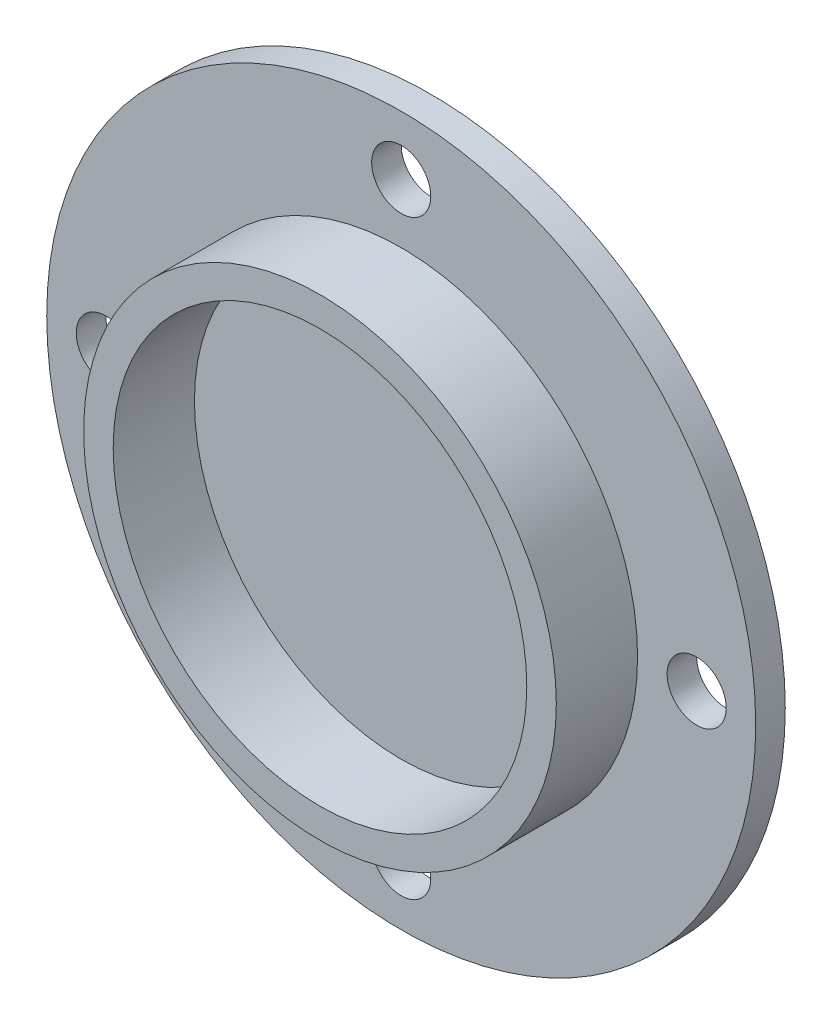
ISO-10303-21;
HEADER;
FILE_DESCRIPTION(('STEP AP214'),'2;1');
FILE_NAME('part.step','',(''),(''),'','','');
FILE_SCHEMA(('AUTOMOTIVE_DESIGN { 1 0 10303 214 1 1 1 1 }'));
ENDSEC;
DATA;
#1=APPLICATION_CONTEXT('core data for automotive mechanical design processes');
#2=APPLICATION_PROTOCOL_DEFINITION('international standard','automotive_design',2000,#1);
#3=PRODUCT_CONTEXT('',#1,'mechanical');
#4=PRODUCT('Part','Part','',(#3));
#5=PRODUCT_RELATED_PRODUCT_CATEGORY('part','',(#4));
#6=PRODUCT_DEFINITION_FORMATION('','',#4);
#7=PRODUCT_DEFINITION_CONTEXT('part definition',#1,'design');
#8=PRODUCT_DEFINITION('design','',#6,#7);
#9=PRODUCT_DEFINITION_SHAPE('','',#8);
#10=(LENGTH_UNIT() NAMED_UNIT(*) SI_UNIT(.MILLI.,.METRE.));
#11=(NAMED_UNIT(*) PLANE_ANGLE_UNIT() SI_UNIT($,.RADIAN.));
#12=(NAMED_UNIT(*) SI_UNIT($,.STERADIAN.) SOLID_ANGLE_UNIT());
#13=UNCERTAINTY_MEASURE_WITH_UNIT(LENGTH_MEASURE(1.E-05),#10,'distance_accuracy_value','');
#14=(GEOMETRIC_REPRESENTATION_CONTEXT(3) GLOBAL_UNCERTAINTY_ASSIGNED_CONTEXT((#13)) GLOBAL_UNIT_ASSIGNED_CONTEXT((#10,
#11,#12)) REPRESENTATION_CONTEXT('',''));
#15=CARTESIAN_POINT('',(0.,0.,0.));
#16=DIRECTION('',(0.,0.,1.));
#17=DIRECTION('',(1.,0.,0.));
#18=AXIS2_PLACEMENT_3D('',#15,#16,#17);
#19=CARTESIAN_POINT('',(0.,0.,10.));
#20=DIRECTION('',(0.,0.,1.));
#21=DIRECTION('',(1.,0.,0.));
#22=AXIS2_PLACEMENT_3D('',#19,#20,#21);
#23=PLANE('',#22);
#24=CARTESIAN_POINT('',(100.,0.,10.));
#25=DIRECTION('',(0.,0.,1.));
#26=DIRECTION('',(1.,0.,0.));
#27=AXIS2_PLACEMENT_3D('',#24,#25,#26);
#28=CIRCLE('',#27,10.);
#29=CARTESIAN_POINT('',(110.,0.,10.));
#30=VERTEX_POINT('',#29);
#31=EDGE_CURVE('E59',#30,#30,#28,.T.);
#32=ORIENTED_EDGE('',*,*,#31,.F.);
#33=EDGE_LOOP('',(#32));
#34=FACE_BOUND('',#33,.T.);
#35=CARTESIAN_POINT('',(0.,100.,10.));
#36=DIRECTION('',(0.,0.,1.));
#37=DIRECTION('',(1.,0.,0.));
#38=AXIS2_PLACEMENT_3D('',#35,#36,#37);
#39=CIRCLE('',#38,10.);
#40=CARTESIAN_POINT('',(10.,100.,10.));
#41=VERTEX_POINT('',#40);
#42=EDGE_CURVE('E45',#41,#41,#39,.T.);
#43=ORIENTED_EDGE('',*,*,#42,.F.);
#44=EDGE_LOOP('',(#43));
#45=FACE_BOUND('',#44,.T.);
#46=CARTESIAN_POINT('',(0.,0.,10.));
#47=DIRECTION('',(0.,0.,1.));
#48=DIRECTION('',(1.,0.,0.));
#49=AXIS2_PLACEMENT_3D('',#46,#47,#48);
#50=CIRCLE('',#49,120.);
#51=CARTESIAN_POINT('',(120.,0.,10.));
#52=VERTEX_POINT('',#51);
#53=EDGE_CURVE('E37',#52,#52,#50,.T.);
#54=ORIENTED_EDGE('',*,*,#53,.T.);
#55=EDGE_LOOP('',(#54));
#56=FACE_BOUND('',#55,.T.);
#57=CARTESIAN_POINT('',(-100.,0.,10.));
#58=DIRECTION('',(0.,0.,1.));
#59=DIRECTION('',(1.,0.,0.));
#60=AXIS2_PLACEMENT_3D('',#57,#58,#59);
#61=CIRCLE('',#60,9.99999999999999);
#62=CARTESIAN_POINT('',(-90.,0.,10.));
#63=VERTEX_POINT('',#62);
#64=EDGE_CURVE('E53',#63,#63,#61,.T.);
#65=ORIENTED_EDGE('',*,*,#64,.F.);
#66=EDGE_LOOP('',(#65));
#67=FACE_BOUND('',#66,.T.);
#68=CARTESIAN_POINT('',(0.,-100.,10.));
#69=DIRECTION('',(0.,0.,1.));
#70=DIRECTION('',(1.,0.,0.));
#71=AXIS2_PLACEMENT_3D('',#68,#69,#70);
#72=CIRCLE('',#71,10.);
#73=CARTESIAN_POINT('',(10.,-100.,10.));
#74=VERTEX_POINT('',#73);
#75=EDGE_CURVE('E65',#74,#74,#72,.T.);
#76=ORIENTED_EDGE('',*,*,#75,.F.);
#77=EDGE_LOOP('',(#76));
#78=FACE_BOUND('',#77,.T.);
#79=CARTESIAN_POINT('',(0.,0.,10.));
#80=DIRECTION('',(0.,0.,1.));
#81=DIRECTION('',(1.,0.,0.));
#82=AXIS2_PLACEMENT_3D('',#79,#80,#81);
#83=CIRCLE('',#82,80.);
#84=CARTESIAN_POINT('',(80.,0.,10.));
#85=VERTEX_POINT('',#84);
#86=EDGE_CURVE('E74',#85,#85,#83,.T.);
#87=ORIENTED_EDGE('',*,*,#86,.F.);
#88=EDGE_LOOP('',(#87));
#89=FACE_BOUND('',#88,.T.);
#90=ADVANCED_FACE('F30',(#34,#45,#56,#67,#78,#89),#23,.T.);
#91=CARTESIAN_POINT('',(0.,0.,0.));
#92=DIRECTION('',(0.,0.,1.));
#93=DIRECTION('',(1.,0.,0.));
#94=AXIS2_PLACEMENT_3D('',#91,#92,#93);
#95=PLANE('',#94);
#96=CARTESIAN_POINT('',(100.,0.,0.));
#97=DIRECTION('',(0.,0.,1.));
#98=DIRECTION('',(1.,0.,0.));
#99=AXIS2_PLACEMENT_3D('',#96,#97,#98);
#100=CIRCLE('',#99,10.);
#101=CARTESIAN_POINT('',(110.,0.,0.));
#102=VERTEX_POINT('',#101);
#103=EDGE_CURVE('E62',#102,#102,#100,.T.);
#104=ORIENTED_EDGE('',*,*,#103,.T.);
#105=EDGE_LOOP('',(#104));
#106=FACE_BOUND('',#105,.T.);
#107=CARTESIAN_POINT('',(0.,100.,0.));
#108=DIRECTION('',(0.,0.,1.));
#109=DIRECTION('',(1.,0.,0.));
#110=AXIS2_PLACEMENT_3D('',#107,#108,#109);
#111=CIRCLE('',#110,10.);
#112=CARTESIAN_POINT('',(10.,100.,0.));
#113=VERTEX_POINT('',#112);
#114=EDGE_CURVE('E50',#113,#113,#111,.T.);
#115=ORIENTED_EDGE('',*,*,#114,.T.);
#116=EDGE_LOOP('',(#115));
#117=FACE_BOUND('',#116,.T.);
#118=CARTESIAN_POINT('',(0.,0.,0.));
#119=DIRECTION('',(0.,0.,1.));
#120=DIRECTION('',(1.,0.,0.));
#121=AXIS2_PLACEMENT_3D('',#118,#119,#120);
#122=CIRCLE('',#121,120.);
#123=CARTESIAN_POINT('',(120.,0.,0.));
#124=VERTEX_POINT('',#123);
#125=EDGE_CURVE('E41',#124,#124,#122,.T.);
#126=ORIENTED_EDGE('',*,*,#125,.F.);
#127=EDGE_LOOP('',(#126));
#128=FACE_BOUND('',#127,.T.);
#129=CARTESIAN_POINT('',(-100.,0.,0.));
#130=DIRECTION('',(0.,0.,1.));
#131=DIRECTION('',(1.,0.,0.));
#132=AXIS2_PLACEMENT_3D('',#129,#130,#131);
#133=CIRCLE('',#132,9.99999999999999);
#134=CARTESIAN_POINT('',(-90.,0.,0.));
#135=VERTEX_POINT('',#134);
#136=EDGE_CURVE('E56',#135,#135,#133,.T.);
#137=ORIENTED_EDGE('',*,*,#136,.T.);
#138=EDGE_LOOP('',(#137));
#139=FACE_BOUND('',#138,.T.);
#140=CARTESIAN_POINT('',(0.,-100.,0.));
#141=DIRECTION('',(0.,0.,1.));
#142=DIRECTION('',(1.,0.,0.));
#143=AXIS2_PLACEMENT_3D('',#140,#141,#142);
#144=CIRCLE('',#143,10.);
#145=CARTESIAN_POINT('',(10.,-100.,0.));
#146=VERTEX_POINT('',#145);
#147=EDGE_CURVE('E68',#146,#146,#144,.T.);
#148=ORIENTED_EDGE('',*,*,#147,.T.);
#149=EDGE_LOOP('',(#148));
#150=FACE_BOUND('',#149,.T.);
#151=ADVANCED_FACE('F100',(#106,#117,#128,#139,#150),#95,.F.);
#152=CARTESIAN_POINT('',(0.,0.,10.));
#153=DIRECTION('',(0.,0.,-1.));
#154=DIRECTION('',(-1.,0.,0.));
#155=AXIS2_PLACEMENT_3D('',#152,#153,#154);
#156=CYLINDRICAL_SURFACE('',#155,120.);
#157=ORIENTED_EDGE('',*,*,#53,.F.);
#158=EDGE_LOOP('',(#157));
#159=FACE_BOUND('',#158,.T.);
#160=ORIENTED_EDGE('',*,*,#125,.T.);
#161=EDGE_LOOP('',(#160));
#162=FACE_BOUND('',#161,.T.);
#163=ADVANCED_FACE('F32',(#159,#162),#156,.T.);
#164=CARTESIAN_POINT('',(0.,100.,10.));
#165=DIRECTION('',(0.,0.,-1.));
#166=DIRECTION('',(-1.,0.,0.));
#167=AXIS2_PLACEMENT_3D('',#164,#165,#166);
#168=CYLINDRICAL_SURFACE('',#167,10.);
#169=ORIENTED_EDGE('',*,*,#42,.T.);
#170=EDGE_LOOP('',(#169));
#171=FACE_BOUND('',#170,.T.);
#172=ORIENTED_EDGE('',*,*,#114,.F.);
#173=EDGE_LOOP('',(#172));
#174=FACE_BOUND('',#173,.T.);
#175=ADVANCED_FACE('F154',(#171,#174),#168,.F.);
#176=CARTESIAN_POINT('',(-100.,0.,10.));
#177=DIRECTION('',(0.,0.,-1.));
#178=DIRECTION('',(-1.,0.,0.));
#179=AXIS2_PLACEMENT_3D('',#176,#177,#178);
#180=CYLINDRICAL_SURFACE('',#179,9.99999999999999);
#181=ORIENTED_EDGE('',*,*,#64,.T.);
#182=EDGE_LOOP('',(#181));
#183=FACE_BOUND('',#182,.T.);
#184=ORIENTED_EDGE('',*,*,#136,.F.);
#185=EDGE_LOOP('',(#184));
#186=FACE_BOUND('',#185,.T.);
#187=ADVANCED_FACE('F144',(#183,#186),#180,.F.);
#188=CARTESIAN_POINT('',(100.,0.,10.));
#189=DIRECTION('',(0.,0.,-1.));
#190=DIRECTION('',(-1.,0.,0.));
#191=AXIS2_PLACEMENT_3D('',#188,#189,#190);
#192=CYLINDRICAL_SURFACE('',#191,10.);
#193=ORIENTED_EDGE('',*,*,#31,.T.);
#194=EDGE_LOOP('',(#193));
#195=FACE_BOUND('',#194,.T.);
#196=ORIENTED_EDGE('',*,*,#103,.F.);
#197=EDGE_LOOP('',(#196));
#198=FACE_BOUND('',#197,.T.);
#199=ADVANCED_FACE('F95',(#195,#198),#192,.F.);
#200=CARTESIAN_POINT('',(0.,-100.,10.));
#201=DIRECTION('',(0.,0.,-1.));
#202=DIRECTION('',(-1.,0.,0.));
#203=AXIS2_PLACEMENT_3D('',#200,#201,#202);
#204=CYLINDRICAL_SURFACE('',#203,10.);
#205=ORIENTED_EDGE('',*,*,#75,.T.);
#206=EDGE_LOOP('',(#205));
#207=FACE_BOUND('',#206,.T.);
#208=ORIENTED_EDGE('',*,*,#147,.F.);
#209=EDGE_LOOP('',(#208));
#210=FACE_BOUND('',#209,.T.);
#211=ADVANCED_FACE('F86',(#207,#210),#204,.F.);
#212=CARTESIAN_POINT('',(0.,0.,37.5));
#213=DIRECTION('',(0.,0.,1.));
#214=DIRECTION('',(1.,0.,0.));
#215=AXIS2_PLACEMENT_3D('',#212,#213,#214);
#216=PLANE('',#215);
#217=CARTESIAN_POINT('',(0.,0.,37.5));
#218=DIRECTION('',(0.,0.,1.));
#219=DIRECTION('',(1.,0.,0.));
#220=AXIS2_PLACEMENT_3D('',#217,#218,#219);
#221=CIRCLE('',#220,80.);
#222=CARTESIAN_POINT('',(80.,0.,37.5));
#223=VERTEX_POINT('',#222);
#224=EDGE_CURVE('E71',#223,#223,#221,.T.);
#225=ORIENTED_EDGE('',*,*,#224,.T.);
#226=EDGE_LOOP('',(#225));
#227=FACE_BOUND('',#226,.T.);
#228=CARTESIAN_POINT('',(0.,0.,37.5));
#229=DIRECTION('',(0.,0.,1.));
#230=DIRECTION('',(1.,0.,0.));
#231=AXIS2_PLACEMENT_3D('',#228,#229,#230);
#232=CIRCLE('',#231,70.);
#233=CARTESIAN_POINT('',(70.,0.,37.5));
#234=VERTEX_POINT('',#233);
#235=EDGE_CURVE('E77',#234,#234,#232,.T.);
#236=ORIENTED_EDGE('',*,*,#235,.F.);
#237=EDGE_LOOP('',(#236));
#238=FACE_BOUND('',#237,.T.);
#239=ADVANCED_FACE('F83',(#227,#238),#216,.T.);
#240=CARTESIAN_POINT('',(0.,0.,37.5));
#241=DIRECTION('',(0.,0.,-1.));
#242=DIRECTION('',(-1.,0.,0.));
#243=AXIS2_PLACEMENT_3D('',#240,#241,#242);
#244=CYLINDRICAL_SURFACE('',#243,80.);
#245=ORIENTED_EDGE('',*,*,#224,.F.);
#246=EDGE_LOOP('',(#245));
#247=FACE_BOUND('',#246,.T.);
#248=ORIENTED_EDGE('',*,*,#86,.T.);
#249=EDGE_LOOP('',(#248));
#250=FACE_BOUND('',#249,.T.);
#251=ADVANCED_FACE('F85',(#247,#250),#244,.T.);
#252=CARTESIAN_POINT('',(0.,0.,37.5));
#253=DIRECTION('',(0.,0.,-1.));
#254=DIRECTION('',(-1.,0.,0.));
#255=AXIS2_PLACEMENT_3D('',#252,#253,#254);
#256=CYLINDRICAL_SURFACE('',#255,70.);
#257=ORIENTED_EDGE('',*,*,#235,.T.);
#258=EDGE_LOOP('',(#257));
#259=FACE_BOUND('',#258,.T.);
#260=CARTESIAN_POINT('',(0.,0.,10.));
#261=DIRECTION('',(0.,0.,1.));
#262=DIRECTION('',(1.,0.,0.));
#263=AXIS2_PLACEMENT_3D('',#260,#261,#262);
#264=CIRCLE('',#263,70.);
#265=CARTESIAN_POINT('',(70.,0.,10.));
#266=VERTEX_POINT('',#265);
#267=EDGE_CURVE('E10',#266,#266,#264,.F.);
#268=ORIENTED_EDGE('',*,*,#267,.T.);
#269=EDGE_LOOP('',(#268));
#270=FACE_BOUND('',#269,.T.);
#271=ADVANCED_FACE('F81',(#259,#270),#256,.F.);
#272=ORIENTED_EDGE('',*,*,#267,.F.);
#273=EDGE_LOOP('',(#272));
#274=FACE_BOUND('',#273,.T.);
#275=ADVANCED_FACE('F102',(#274),#23,.T.);
#276=CLOSED_SHELL('',(#90,#151,#163,#175,#187,#199,#211,#239,#251,#271,#275));
#277=MANIFOLD_SOLID_BREP('B2',#276);
#278=ADVANCED_BREP_SHAPE_REPRESENTATION('',(#18,#277),#14);
#279=SHAPE_DEFINITION_REPRESENTATION(#9,#278);
ENDSEC;
END-ISO-10303-21;
